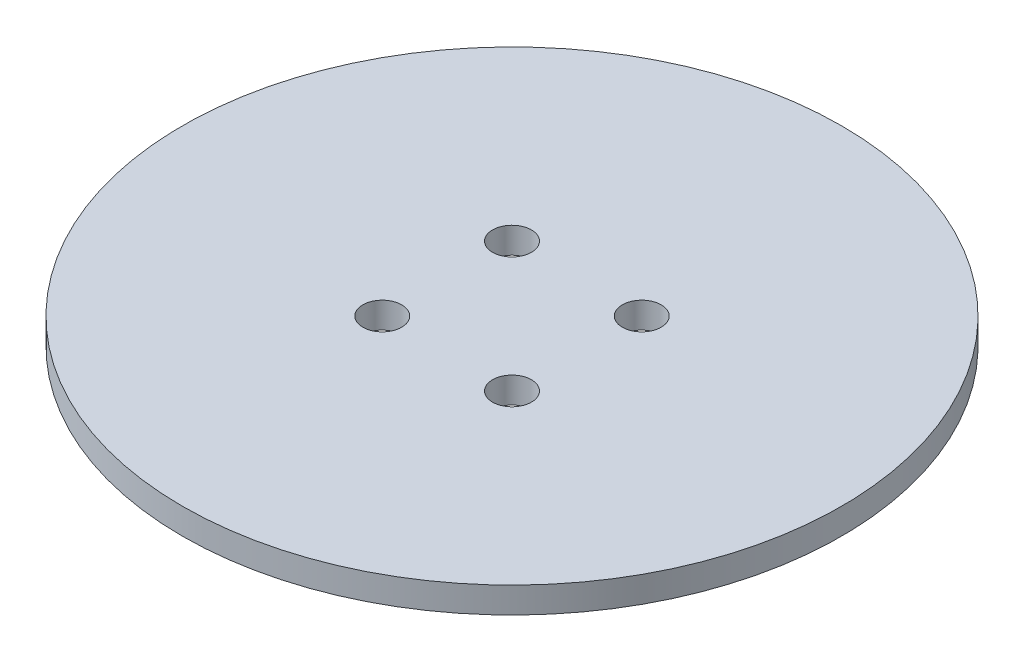
ISO-10303-21;
HEADER;
FILE_DESCRIPTION(('STEP AP214'),'2;1');
FILE_NAME('part.step','',(''),(''),'','','');
FILE_SCHEMA(('AUTOMOTIVE_DESIGN { 1 0 10303 214 1 1 1 1 }'));
ENDSEC;
DATA;
#1=APPLICATION_CONTEXT('core data for automotive mechanical design processes');
#2=APPLICATION_PROTOCOL_DEFINITION('international standard','automotive_design',2000,#1);
#3=PRODUCT_CONTEXT('',#1,'mechanical');
#4=PRODUCT('Part','Part','',(#3));
#5=PRODUCT_RELATED_PRODUCT_CATEGORY('part','',(#4));
#6=PRODUCT_DEFINITION_FORMATION('','',#4);
#7=PRODUCT_DEFINITION_CONTEXT('part definition',#1,'design');
#8=PRODUCT_DEFINITION('design','',#6,#7);
#9=PRODUCT_DEFINITION_SHAPE('','',#8);
#10=(LENGTH_UNIT() NAMED_UNIT(*) SI_UNIT(.MILLI.,.METRE.));
#11=(NAMED_UNIT(*) PLANE_ANGLE_UNIT() SI_UNIT($,.RADIAN.));
#12=(NAMED_UNIT(*) SI_UNIT($,.STERADIAN.) SOLID_ANGLE_UNIT());
#13=UNCERTAINTY_MEASURE_WITH_UNIT(LENGTH_MEASURE(1.E-05),#10,'distance_accuracy_value','');
#14=(GEOMETRIC_REPRESENTATION_CONTEXT(3) GLOBAL_UNCERTAINTY_ASSIGNED_CONTEXT((#13)) GLOBAL_UNIT_ASSIGNED_CONTEXT((#10,
#11,#12)) REPRESENTATION_CONTEXT('',''));
#15=CARTESIAN_POINT('',(0.,0.,0.));
#16=DIRECTION('',(0.,0.,1.));
#17=DIRECTION('',(1.,0.,0.));
#18=AXIS2_PLACEMENT_3D('',#15,#16,#17);
#19=CARTESIAN_POINT('',(0.,3.,0.));
#20=DIRECTION('',(0.,-1.,0.));
#21=DIRECTION('',(0.,0.,-1.));
#22=AXIS2_PLACEMENT_3D('',#19,#20,#21);
#23=CYLINDRICAL_SURFACE('',#22,38.1);
#24=CARTESIAN_POINT('',(0.,3.,0.));
#25=DIRECTION('',(0.,1.,0.));
#26=DIRECTION('',(0.,0.,1.));
#27=AXIS2_PLACEMENT_3D('',#24,#25,#26);
#28=CIRCLE('',#27,38.1);
#29=CARTESIAN_POINT('',(0.,3.,38.1));
#30=VERTEX_POINT('',#29);
#31=EDGE_CURVE('E10',#30,#30,#28,.T.);
#32=ORIENTED_EDGE('',*,*,#31,.F.);
#33=EDGE_LOOP('',(#32));
#34=FACE_BOUND('',#33,.T.);
#35=CARTESIAN_POINT('',(0.,0.,0.));
#36=DIRECTION('',(0.,1.,0.));
#37=DIRECTION('',(0.,0.,1.));
#38=AXIS2_PLACEMENT_3D('',#35,#36,#37);
#39=CIRCLE('',#38,38.1);
#40=CARTESIAN_POINT('',(0.,0.,38.1));
#41=VERTEX_POINT('',#40);
#42=EDGE_CURVE('E33',#41,#41,#39,.T.);
#43=ORIENTED_EDGE('',*,*,#42,.T.);
#44=EDGE_LOOP('',(#43));
#45=FACE_BOUND('',#44,.T.);
#46=ADVANCED_FACE('F30',(#34,#45),#23,.T.);
#47=CARTESIAN_POINT('',(0.,3.,0.));
#48=DIRECTION('',(0.,1.,0.));
#49=DIRECTION('',(0.,0.,1.));
#50=AXIS2_PLACEMENT_3D('',#47,#48,#49);
#51=PLANE('',#50);
#52=CARTESIAN_POINT('',(-7.5,3.,-7.5));
#53=DIRECTION('',(0.,1.,0.));
#54=DIRECTION('',(0.,0.,1.));
#55=AXIS2_PLACEMENT_3D('',#52,#53,#54);
#56=CIRCLE('',#55,2.2479);
#57=CARTESIAN_POINT('',(-7.5,3.,-5.2521));
#58=VERTEX_POINT('',#57);
#59=EDGE_CURVE('E62',#58,#58,#56,.T.);
#60=ORIENTED_EDGE('',*,*,#59,.F.);
#61=EDGE_LOOP('',(#60));
#62=FACE_BOUND('',#61,.T.);
#63=CARTESIAN_POINT('',(7.5,3.,-7.5));
#64=DIRECTION('',(0.,1.,0.));
#65=DIRECTION('',(0.,0.,1.));
#66=AXIS2_PLACEMENT_3D('',#63,#64,#65);
#67=CIRCLE('',#66,2.2479);
#68=CARTESIAN_POINT('',(7.5,3.,-5.2521));
#69=VERTEX_POINT('',#68);
#70=EDGE_CURVE('E56',#69,#69,#67,.T.);
#71=ORIENTED_EDGE('',*,*,#70,.F.);
#72=EDGE_LOOP('',(#71));
#73=FACE_BOUND('',#72,.T.);
#74=CARTESIAN_POINT('',(-7.5,3.,7.5));
#75=DIRECTION('',(0.,1.,0.));
#76=DIRECTION('',(0.,0.,1.));
#77=AXIS2_PLACEMENT_3D('',#74,#75,#76);
#78=CIRCLE('',#77,2.2479);
#79=CARTESIAN_POINT('',(-7.5,3.,9.7479));
#80=VERTEX_POINT('',#79);
#81=EDGE_CURVE('E50',#80,#80,#78,.T.);
#82=ORIENTED_EDGE('',*,*,#81,.F.);
#83=EDGE_LOOP('',(#82));
#84=FACE_BOUND('',#83,.T.);
#85=CARTESIAN_POINT('',(7.5,3.,7.5));
#86=DIRECTION('',(0.,1.,0.));
#87=DIRECTION('',(0.,0.,1.));
#88=AXIS2_PLACEMENT_3D('',#85,#86,#87);
#89=CIRCLE('',#88,2.2479);
#90=CARTESIAN_POINT('',(7.5,3.,9.7479));
#91=VERTEX_POINT('',#90);
#92=EDGE_CURVE('E44',#91,#91,#89,.T.);
#93=ORIENTED_EDGE('',*,*,#92,.F.);
#94=EDGE_LOOP('',(#93));
#95=FACE_BOUND('',#94,.T.);
#96=ORIENTED_EDGE('',*,*,#31,.T.);
#97=EDGE_LOOP('',(#96));
#98=FACE_BOUND('',#97,.T.);
#99=ADVANCED_FACE('F68',(#62,#73,#84,#95,#98),#51,.T.);
#100=CARTESIAN_POINT('',(0.,0.,0.));
#101=DIRECTION('',(0.,1.,0.));
#102=DIRECTION('',(0.,0.,1.));
#103=AXIS2_PLACEMENT_3D('',#100,#101,#102);
#104=PLANE('',#103);
#105=CARTESIAN_POINT('',(-7.5,0.,-7.5));
#106=DIRECTION('',(0.,1.,0.));
#107=DIRECTION('',(0.,0.,1.));
#108=AXIS2_PLACEMENT_3D('',#105,#106,#107);
#109=CIRCLE('',#108,2.2479);
#110=CARTESIAN_POINT('',(-7.5,0.,-5.2521));
#111=VERTEX_POINT('',#110);
#112=EDGE_CURVE('E59',#111,#111,#109,.T.);
#113=ORIENTED_EDGE('',*,*,#112,.T.);
#114=EDGE_LOOP('',(#113));
#115=FACE_BOUND('',#114,.T.);
#116=CARTESIAN_POINT('',(7.5,0.,-7.5));
#117=DIRECTION('',(0.,1.,0.));
#118=DIRECTION('',(0.,0.,1.));
#119=AXIS2_PLACEMENT_3D('',#116,#117,#118);
#120=CIRCLE('',#119,2.2479);
#121=CARTESIAN_POINT('',(7.5,0.,-5.2521));
#122=VERTEX_POINT('',#121);
#123=EDGE_CURVE('E53',#122,#122,#120,.T.);
#124=ORIENTED_EDGE('',*,*,#123,.T.);
#125=EDGE_LOOP('',(#124));
#126=FACE_BOUND('',#125,.T.);
#127=CARTESIAN_POINT('',(-7.5,0.,7.5));
#128=DIRECTION('',(0.,1.,0.));
#129=DIRECTION('',(0.,0.,1.));
#130=AXIS2_PLACEMENT_3D('',#127,#128,#129);
#131=CIRCLE('',#130,2.2479);
#132=CARTESIAN_POINT('',(-7.5,0.,9.7479));
#133=VERTEX_POINT('',#132);
#134=EDGE_CURVE('E47',#133,#133,#131,.T.);
#135=ORIENTED_EDGE('',*,*,#134,.T.);
#136=EDGE_LOOP('',(#135));
#137=FACE_BOUND('',#136,.T.);
#138=CARTESIAN_POINT('',(7.5,0.,7.5));
#139=DIRECTION('',(0.,1.,0.));
#140=DIRECTION('',(0.,0.,1.));
#141=AXIS2_PLACEMENT_3D('',#138,#139,#140);
#142=CIRCLE('',#141,2.2479);
#143=CARTESIAN_POINT('',(7.5,0.,9.7479));
#144=VERTEX_POINT('',#143);
#145=EDGE_CURVE('E40',#144,#144,#142,.T.);
#146=ORIENTED_EDGE('',*,*,#145,.T.);
#147=EDGE_LOOP('',(#146));
#148=FACE_BOUND('',#147,.T.);
#149=ORIENTED_EDGE('',*,*,#42,.F.);
#150=EDGE_LOOP('',(#149));
#151=FACE_BOUND('',#150,.T.);
#152=ADVANCED_FACE('F71',(#115,#126,#137,#148,#151),#104,.F.);
#153=CARTESIAN_POINT('',(7.5,3.,7.5));
#154=DIRECTION('',(0.,1.,0.));
#155=DIRECTION('',(0.,0.,1.));
#156=AXIS2_PLACEMENT_3D('',#153,#154,#155);
#157=CYLINDRICAL_SURFACE('',#156,2.2479);
#158=ORIENTED_EDGE('',*,*,#145,.F.);
#159=EDGE_LOOP('',(#158));
#160=FACE_BOUND('',#159,.T.);
#161=ORIENTED_EDGE('',*,*,#92,.T.);
#162=EDGE_LOOP('',(#161));
#163=FACE_BOUND('',#162,.T.);
#164=ADVANCED_FACE('F79',(#160,#163),#157,.F.);
#165=CARTESIAN_POINT('',(-7.5,3.,7.5));
#166=DIRECTION('',(0.,1.,0.));
#167=DIRECTION('',(0.,0.,1.));
#168=AXIS2_PLACEMENT_3D('',#165,#166,#167);
#169=CYLINDRICAL_SURFACE('',#168,2.2479);
#170=ORIENTED_EDGE('',*,*,#134,.F.);
#171=EDGE_LOOP('',(#170));
#172=FACE_BOUND('',#171,.T.);
#173=ORIENTED_EDGE('',*,*,#81,.T.);
#174=EDGE_LOOP('',(#173));
#175=FACE_BOUND('',#174,.T.);
#176=ADVANCED_FACE('F81',(#172,#175),#169,.F.);
#177=CARTESIAN_POINT('',(7.5,3.,-7.5));
#178=DIRECTION('',(0.,1.,0.));
#179=DIRECTION('',(0.,0.,1.));
#180=AXIS2_PLACEMENT_3D('',#177,#178,#179);
#181=CYLINDRICAL_SURFACE('',#180,2.2479);
#182=ORIENTED_EDGE('',*,*,#123,.F.);
#183=EDGE_LOOP('',(#182));
#184=FACE_BOUND('',#183,.T.);
#185=ORIENTED_EDGE('',*,*,#70,.T.);
#186=EDGE_LOOP('',(#185));
#187=FACE_BOUND('',#186,.T.);
#188=ADVANCED_FACE('F88',(#184,#187),#181,.F.);
#189=CARTESIAN_POINT('',(-7.5,3.,-7.5));
#190=DIRECTION('',(0.,1.,0.));
#191=DIRECTION('',(0.,0.,1.));
#192=AXIS2_PLACEMENT_3D('',#189,#190,#191);
#193=CYLINDRICAL_SURFACE('',#192,2.2479);
#194=ORIENTED_EDGE('',*,*,#112,.F.);
#195=EDGE_LOOP('',(#194));
#196=FACE_BOUND('',#195,.T.);
#197=ORIENTED_EDGE('',*,*,#59,.T.);
#198=EDGE_LOOP('',(#197));
#199=FACE_BOUND('',#198,.T.);
#200=ADVANCED_FACE('F66',(#196,#199),#193,.F.);
#201=CLOSED_SHELL('',(#46,#99,#152,#164,#176,#188,#200));
#202=MANIFOLD_SOLID_BREP('B2',#201);
#203=ADVANCED_BREP_SHAPE_REPRESENTATION('',(#18,#202),#14);
#204=SHAPE_DEFINITION_REPRESENTATION(#9,#203);
ENDSEC;
END-ISO-10303-21;
